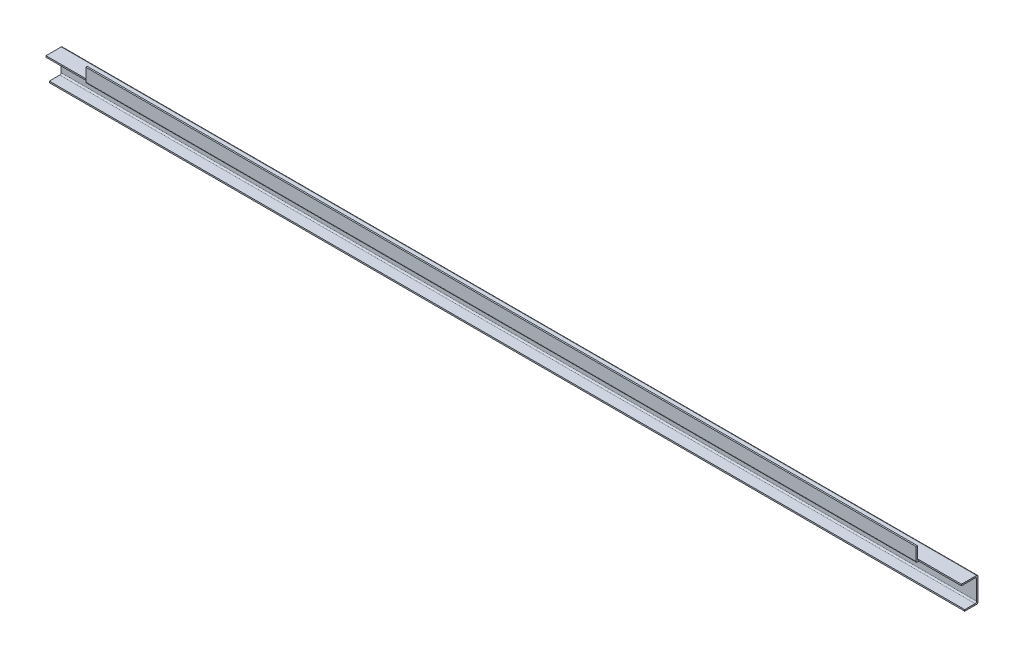
ISO-10303-21;
HEADER;
FILE_DESCRIPTION(('STEP AP214'),'2;1');
FILE_NAME('part.step','',(''),(''),'','','');
FILE_SCHEMA(('AUTOMOTIVE_DESIGN { 1 0 10303 214 1 1 1 1 }'));
ENDSEC;
DATA;
#1=APPLICATION_CONTEXT('core data for automotive mechanical design processes');
#2=APPLICATION_PROTOCOL_DEFINITION('international standard','automotive_design',2000,#1);
#3=PRODUCT_CONTEXT('',#1,'mechanical');
#4=PRODUCT('Part','Part','',(#3));
#5=PRODUCT_RELATED_PRODUCT_CATEGORY('part','',(#4));
#6=PRODUCT_DEFINITION_FORMATION('','',#4);
#7=PRODUCT_DEFINITION_CONTEXT('part definition',#1,'design');
#8=PRODUCT_DEFINITION('design','',#6,#7);
#9=PRODUCT_DEFINITION_SHAPE('','',#8);
#10=(LENGTH_UNIT() NAMED_UNIT(*) SI_UNIT(.MILLI.,.METRE.));
#11=(NAMED_UNIT(*) PLANE_ANGLE_UNIT() SI_UNIT($,.RADIAN.));
#12=(NAMED_UNIT(*) SI_UNIT($,.STERADIAN.) SOLID_ANGLE_UNIT());
#13=UNCERTAINTY_MEASURE_WITH_UNIT(LENGTH_MEASURE(1.E-05),#10,'distance_accuracy_value','');
#14=(GEOMETRIC_REPRESENTATION_CONTEXT(3) GLOBAL_UNCERTAINTY_ASSIGNED_CONTEXT((#13)) GLOBAL_UNIT_ASSIGNED_CONTEXT((#10,
#11,#12)) REPRESENTATION_CONTEXT('',''));
#15=CARTESIAN_POINT('',(0.,0.,0.));
#16=DIRECTION('',(0.,0.,1.));
#17=DIRECTION('',(1.,0.,0.));
#18=AXIS2_PLACEMENT_3D('',#15,#16,#17);
#19=CARTESIAN_POINT('',(1934.,0.,0.));
#20=DIRECTION('',(1.,0.,0.));
#21=DIRECTION('',(0.,0.,-1.));
#22=AXIS2_PLACEMENT_3D('',#19,#20,#21);
#23=PLANE('',#22);
#24=DIRECTION('',(0.,0.,1.));
#25=VECTOR('',#24,1.);
#26=CARTESIAN_POINT('',(1934.,50.,-28.));
#27=LINE('',#26,#25);
#28=CARTESIAN_POINT('',(1934.,50.,-25.));
#29=VERTEX_POINT('',#28);
#30=CARTESIAN_POINT('',(1934.,50.,7.00000000000001));
#31=VERTEX_POINT('',#30);
#32=EDGE_CURVE('E226',#29,#31,#27,.T.);
#33=ORIENTED_EDGE('',*,*,#32,.T.);
#34=DIRECTION('',(0.,1.,0.));
#35=VECTOR('',#34,1.);
#36=CARTESIAN_POINT('',(1934.,47.,7.00000000000001));
#37=LINE('',#36,#35);
#38=CARTESIAN_POINT('',(1934.,47.,7.00000000000001));
#39=VERTEX_POINT('',#38);
#40=EDGE_CURVE('E173',#39,#31,#37,.T.);
#41=ORIENTED_EDGE('',*,*,#40,.F.);
#42=DIRECTION('',(0.,0.,-1.));
#43=VECTOR('',#42,1.);
#44=CARTESIAN_POINT('',(1934.,47.,-25.));
#45=LINE('',#44,#43);
#46=CARTESIAN_POINT('',(1934.,47.,-22.));
#47=VERTEX_POINT('',#46);
#48=EDGE_CURVE('E183',#39,#47,#45,.T.);
#49=ORIENTED_EDGE('',*,*,#48,.T.);
#50=CARTESIAN_POINT('',(1934.,44.,-22.));
#51=DIRECTION('',(1.,0.,0.));
#52=DIRECTION('',(0.,0.,-1.));
#53=AXIS2_PLACEMENT_3D('',#50,#51,#52);
#54=CIRCLE('',#53,3.);
#55=CARTESIAN_POINT('',(1934.,44.,-25.));
#56=VERTEX_POINT('',#55);
#57=EDGE_CURVE('E307',#47,#56,#54,.F.);
#58=ORIENTED_EDGE('',*,*,#57,.T.);
#59=DIRECTION('',(0.,-1.,0.));
#60=VECTOR('',#59,1.);
#61=CARTESIAN_POINT('',(1934.,0.,-25.));
#62=LINE('',#61,#60);
#63=CARTESIAN_POINT('',(1934.,3.,-25.));
#64=VERTEX_POINT('',#63);
#65=EDGE_CURVE('E230',#56,#64,#62,.T.);
#66=ORIENTED_EDGE('',*,*,#65,.T.);
#67=CARTESIAN_POINT('',(1934.,3.,-22.));
#68=DIRECTION('',(1.,0.,0.));
#69=DIRECTION('',(0.,0.,-1.));
#70=AXIS2_PLACEMENT_3D('',#67,#68,#69);
#71=CIRCLE('',#70,3.);
#72=CARTESIAN_POINT('',(1934.,0.,-22.));
#73=VERTEX_POINT('',#72);
#74=EDGE_CURVE('E302',#64,#73,#71,.F.);
#75=ORIENTED_EDGE('',*,*,#74,.T.);
#76=DIRECTION('',(0.,0.,1.));
#77=VECTOR('',#76,1.);
#78=CARTESIAN_POINT('',(1934.,0.,0.));
#79=LINE('',#78,#77);
#80=CARTESIAN_POINT('',(1934.,0.,0.));
#81=VERTEX_POINT('',#80);
#82=EDGE_CURVE('E233',#73,#81,#79,.T.);
#83=ORIENTED_EDGE('',*,*,#82,.T.);
#84=DIRECTION('',(0.,-1.,0.));
#85=VECTOR('',#84,1.);
#86=CARTESIAN_POINT('',(1934.,0.,0.));
#87=LINE('',#86,#85);
#88=CARTESIAN_POINT('',(1934.,-3.,0.));
#89=VERTEX_POINT('',#88);
#90=EDGE_CURVE('E216',#81,#89,#87,.T.);
#91=ORIENTED_EDGE('',*,*,#90,.T.);
#92=DIRECTION('',(0.,0.,-1.));
#93=VECTOR('',#92,1.);
#94=CARTESIAN_POINT('',(1934.,-3.,0.));
#95=LINE('',#94,#93);
#96=CARTESIAN_POINT('',(1934.,-3.,-25.));
#97=VERTEX_POINT('',#96);
#98=EDGE_CURVE('E219',#89,#97,#95,.T.);
#99=ORIENTED_EDGE('',*,*,#98,.T.);
#100=CARTESIAN_POINT('',(1934.,0.,-25.));
#101=DIRECTION('',(1.,0.,0.));
#102=DIRECTION('',(0.,0.,-1.));
#103=AXIS2_PLACEMENT_3D('',#100,#101,#102);
#104=CIRCLE('',#103,3.);
#105=CARTESIAN_POINT('',(1934.,0.,-28.));
#106=VERTEX_POINT('',#105);
#107=EDGE_CURVE('E275',#97,#106,#104,.T.);
#108=ORIENTED_EDGE('',*,*,#107,.T.);
#109=DIRECTION('',(0.,1.,0.));
#110=VECTOR('',#109,1.);
#111=CARTESIAN_POINT('',(1934.,-3.,-28.));
#112=LINE('',#111,#110);
#113=CARTESIAN_POINT('',(1934.,47.,-28.));
#114=VERTEX_POINT('',#113);
#115=EDGE_CURVE('E223',#106,#114,#112,.T.);
#116=ORIENTED_EDGE('',*,*,#115,.T.);
#117=CARTESIAN_POINT('',(1934.,47.,-25.));
#118=DIRECTION('',(1.,0.,0.));
#119=DIRECTION('',(0.,0.,-1.));
#120=AXIS2_PLACEMENT_3D('',#117,#118,#119);
#121=CIRCLE('',#120,3.);
#122=EDGE_CURVE('E273',#114,#29,#121,.T.);
#123=ORIENTED_EDGE('',*,*,#122,.T.);
#124=EDGE_LOOP('',(#33,#41,#49,#58,#66,#75,#83,#91,#99,#108,#116,#123));
#125=FACE_BOUND('',#124,.T.);
#126=ADVANCED_FACE('F33',(#125),#23,.T.);
#127=CARTESIAN_POINT('',(1934.,0.,0.));
#128=DIRECTION('',(0.,0.,-1.));
#129=DIRECTION('',(-1.,0.,0.));
#130=AXIS2_PLACEMENT_3D('',#127,#128,#129);
#131=PLANE('',#130);
#132=DIRECTION('',(0.,-1.,0.));
#133=VECTOR('',#132,1.);
#134=CARTESIAN_POINT('',(0.,0.,0.));
#135=LINE('',#134,#133);
#136=CARTESIAN_POINT('',(0.,0.,0.));
#137=VERTEX_POINT('',#136);
#138=CARTESIAN_POINT('',(0.,-3.,0.));
#139=VERTEX_POINT('',#138);
#140=EDGE_CURVE('E215',#137,#139,#135,.T.);
#141=ORIENTED_EDGE('',*,*,#140,.T.);
#142=DIRECTION('',(-1.,0.,0.));
#143=VECTOR('',#142,1.);
#144=CARTESIAN_POINT('',(1934.,-3.,0.));
#145=LINE('',#144,#143);
#146=EDGE_CURVE('E259',#89,#139,#145,.T.);
#147=ORIENTED_EDGE('',*,*,#146,.F.);
#148=ORIENTED_EDGE('',*,*,#90,.F.);
#149=DIRECTION('',(-1.,0.,0.));
#150=VECTOR('',#149,1.);
#151=CARTESIAN_POINT('',(1934.,0.,0.));
#152=LINE('',#151,#150);
#153=EDGE_CURVE('E235',#81,#137,#152,.T.);
#154=ORIENTED_EDGE('',*,*,#153,.T.);
#155=EDGE_LOOP('',(#141,#147,#148,#154));
#156=FACE_BOUND('',#155,.T.);
#157=ADVANCED_FACE('F330',(#156),#131,.F.);
#158=CARTESIAN_POINT('',(1934.,-3.,0.));
#159=DIRECTION('',(0.,1.,0.));
#160=DIRECTION('',(0.,0.,1.));
#161=AXIS2_PLACEMENT_3D('',#158,#159,#160);
#162=PLANE('',#161);
#163=DIRECTION('',(0.,0.,-1.));
#164=VECTOR('',#163,1.);
#165=CARTESIAN_POINT('',(0.,-3.,0.));
#166=LINE('',#165,#164);
#167=CARTESIAN_POINT('',(0.,-3.,-25.));
#168=VERTEX_POINT('',#167);
#169=EDGE_CURVE('E238',#139,#168,#166,.T.);
#170=ORIENTED_EDGE('',*,*,#169,.T.);
#171=DIRECTION('',(-1.,0.,0.));
#172=VECTOR('',#171,1.);
#173=CARTESIAN_POINT('',(1934.,-3.,-25.));
#174=LINE('',#173,#172);
#175=EDGE_CURVE('E271',#168,#97,#174,.F.);
#176=ORIENTED_EDGE('',*,*,#175,.T.);
#177=ORIENTED_EDGE('',*,*,#98,.F.);
#178=ORIENTED_EDGE('',*,*,#146,.T.);
#179=EDGE_LOOP('',(#170,#176,#177,#178));
#180=FACE_BOUND('',#179,.T.);
#181=ADVANCED_FACE('F336',(#180),#162,.F.);
#182=CARTESIAN_POINT('',(1934.,-3.,-28.));
#183=DIRECTION('',(0.,0.,1.));
#184=DIRECTION('',(1.,0.,0.));
#185=AXIS2_PLACEMENT_3D('',#182,#183,#184);
#186=PLANE('',#185);
#187=ORIENTED_EDGE('',*,*,#115,.F.);
#188=DIRECTION('',(-1.,0.,0.));
#189=VECTOR('',#188,1.);
#190=CARTESIAN_POINT('',(1934.,0.,-28.));
#191=LINE('',#190,#189);
#192=CARTESIAN_POINT('',(0.,0.,-28.));
#193=VERTEX_POINT('',#192);
#194=EDGE_CURVE('E264',#106,#193,#191,.T.);
#195=ORIENTED_EDGE('',*,*,#194,.T.);
#196=DIRECTION('',(0.,1.,0.));
#197=VECTOR('',#196,1.);
#198=CARTESIAN_POINT('',(0.,-3.,-28.));
#199=LINE('',#198,#197);
#200=CARTESIAN_POINT('',(0.,47.,-28.));
#201=VERTEX_POINT('',#200);
#202=EDGE_CURVE('E241',#193,#201,#199,.T.);
#203=ORIENTED_EDGE('',*,*,#202,.T.);
#204=DIRECTION('',(-1.,0.,0.));
#205=VECTOR('',#204,1.);
#206=CARTESIAN_POINT('',(1934.,47.,-28.));
#207=LINE('',#206,#205);
#208=EDGE_CURVE('E262',#201,#114,#207,.F.);
#209=ORIENTED_EDGE('',*,*,#208,.T.);
#210=EDGE_LOOP('',(#187,#195,#203,#209));
#211=FACE_BOUND('',#210,.T.);
#212=ADVANCED_FACE('F369',(#211),#186,.F.);
#213=CARTESIAN_POINT('',(1934.,50.,-28.));
#214=DIRECTION('',(0.,-1.,0.));
#215=DIRECTION('',(0.,0.,-1.));
#216=AXIS2_PLACEMENT_3D('',#213,#214,#215);
#217=PLANE('',#216);
#218=ORIENTED_EDGE('',*,*,#32,.F.);
#219=DIRECTION('',(-1.,0.,0.));
#220=VECTOR('',#219,1.);
#221=CARTESIAN_POINT('',(1934.,50.,-25.));
#222=LINE('',#221,#220);
#223=CARTESIAN_POINT('',(0.,50.,-25.));
#224=VERTEX_POINT('',#223);
#225=EDGE_CURVE('E280',#29,#224,#222,.T.);
#226=ORIENTED_EDGE('',*,*,#225,.T.);
#227=DIRECTION('',(0.,0.,1.));
#228=VECTOR('',#227,1.);
#229=CARTESIAN_POINT('',(0.,50.,-28.));
#230=LINE('',#229,#228);
#231=CARTESIAN_POINT('',(0.,50.,7.00000000000001));
#232=VERTEX_POINT('',#231);
#233=EDGE_CURVE('E244',#224,#232,#230,.T.);
#234=ORIENTED_EDGE('',*,*,#233,.T.);
#235=DIRECTION('',(-1.,0.,0.));
#236=VECTOR('',#235,1.);
#237=CARTESIAN_POINT('',(1934.,50.,7.));
#238=LINE('',#237,#236);
#239=CARTESIAN_POINT('',(89.9999999999999,50.,7.00000000000001));
#240=VERTEX_POINT('',#239);
#241=EDGE_CURVE('E277',#232,#240,#238,.F.);
#242=ORIENTED_EDGE('',*,*,#241,.T.);
#243=CARTESIAN_POINT('',(1844.,50.,7.00000000000001));
#244=VERTEX_POINT('',#243);
#245=EDGE_CURVE('E281',#240,#244,#238,.F.);
#246=ORIENTED_EDGE('',*,*,#245,.T.);
#247=EDGE_CURVE('E171',#244,#31,#238,.F.);
#248=ORIENTED_EDGE('',*,*,#247,.T.);
#249=EDGE_LOOP('',(#218,#226,#234,#242,#246,#248));
#250=FACE_BOUND('',#249,.T.);
#251=ADVANCED_FACE('F365',(#250),#217,.F.);
#252=CARTESIAN_POINT('',(1934.,50.,10.));
#253=DIRECTION('',(0.,0.,1.));
#254=DIRECTION('',(1.,0.,0.));
#255=AXIS2_PLACEMENT_3D('',#252,#253,#254);
#256=PLANE('',#255);
#257=DIRECTION('',(-1.,0.,0.));
#258=VECTOR('',#257,1.);
#259=CARTESIAN_POINT('',(1934.,77.,10.));
#260=LINE('',#259,#258);
#261=CARTESIAN_POINT('',(1844.,77.,10.));
#262=VERTEX_POINT('',#261);
#263=CARTESIAN_POINT('',(89.9999999999999,76.9999999999999,10.));
#264=VERTEX_POINT('',#263);
#265=EDGE_CURVE('E257',#262,#264,#260,.T.);
#266=ORIENTED_EDGE('',*,*,#265,.F.);
#267=DIRECTION('',(0.,-1.,0.));
#268=VECTOR('',#267,1.);
#269=CARTESIAN_POINT('',(1844.,50.,10.));
#270=LINE('',#269,#268);
#271=CARTESIAN_POINT('',(1844.,53.,10.));
#272=VERTEX_POINT('',#271);
#273=EDGE_CURVE('E190',#262,#272,#270,.T.);
#274=ORIENTED_EDGE('',*,*,#273,.T.);
#275=DIRECTION('',(-1.,0.,0.));
#276=VECTOR('',#275,1.);
#277=CARTESIAN_POINT('',(0.,53.,10.));
#278=LINE('',#277,#276);
#279=CARTESIAN_POINT('',(89.9999999999999,53.,10.));
#280=VERTEX_POINT('',#279);
#281=EDGE_CURVE('E284',#272,#280,#278,.T.);
#282=ORIENTED_EDGE('',*,*,#281,.T.);
#283=DIRECTION('',(0.,1.,0.));
#284=VECTOR('',#283,1.);
#285=CARTESIAN_POINT('',(89.9999999999999,50.,10.));
#286=LINE('',#285,#284);
#287=EDGE_CURVE('E212',#280,#264,#286,.T.);
#288=ORIENTED_EDGE('',*,*,#287,.T.);
#289=EDGE_LOOP('',(#266,#274,#282,#288));
#290=FACE_BOUND('',#289,.T.);
#291=ADVANCED_FACE('F361',(#290),#256,.F.);
#292=CARTESIAN_POINT('',(1934.,77.,13.));
#293=DIRECTION('',(0.,-1.,0.));
#294=DIRECTION('',(0.,0.,-1.));
#295=AXIS2_PLACEMENT_3D('',#292,#293,#294);
#296=PLANE('',#295);
#297=DIRECTION('',(-1.,0.,0.));
#298=VECTOR('',#297,1.);
#299=CARTESIAN_POINT('',(1934.,77.,13.));
#300=LINE('',#299,#298);
#301=CARTESIAN_POINT('',(1844.,77.,13.));
#302=VERTEX_POINT('',#301);
#303=CARTESIAN_POINT('',(89.9999999999999,76.9999999999999,13.));
#304=VERTEX_POINT('',#303);
#305=EDGE_CURVE('E255',#302,#304,#300,.T.);
#306=ORIENTED_EDGE('',*,*,#305,.F.);
#307=DIRECTION('',(0.,0.,1.));
#308=VECTOR('',#307,1.);
#309=CARTESIAN_POINT('',(1844.,77.,7.00000000000001));
#310=LINE('',#309,#308);
#311=EDGE_CURVE('E178',#262,#302,#310,.T.);
#312=ORIENTED_EDGE('',*,*,#311,.F.);
#313=ORIENTED_EDGE('',*,*,#265,.T.);
#314=DIRECTION('',(0.,0.,1.));
#315=VECTOR('',#314,1.);
#316=CARTESIAN_POINT('',(89.9999999999999,76.9999999999999,7.00000000000001));
#317=LINE('',#316,#315);
#318=EDGE_CURVE('E205',#264,#304,#317,.T.);
#319=ORIENTED_EDGE('',*,*,#318,.T.);
#320=EDGE_LOOP('',(#306,#312,#313,#319));
#321=FACE_BOUND('',#320,.T.);
#322=ADVANCED_FACE('F358',(#321),#296,.F.);
#323=CARTESIAN_POINT('',(1934.,47.,13.));
#324=DIRECTION('',(0.,0.,-1.));
#325=DIRECTION('',(0.,1.,0.));
#326=AXIS2_PLACEMENT_3D('',#323,#324,#325);
#327=PLANE('',#326);
#328=DIRECTION('',(-1.,0.,0.));
#329=VECTOR('',#328,1.);
#330=CARTESIAN_POINT('',(1934.,50.,13.));
#331=LINE('',#330,#329);
#332=CARTESIAN_POINT('',(89.9999999999999,50.,13.));
#333=VERTEX_POINT('',#332);
#334=CARTESIAN_POINT('',(1844.,50.,13.));
#335=VERTEX_POINT('',#334);
#336=EDGE_CURVE('E297',#333,#335,#331,.F.);
#337=ORIENTED_EDGE('',*,*,#336,.T.);
#338=DIRECTION('',(0.,-1.,0.));
#339=VECTOR('',#338,1.);
#340=CARTESIAN_POINT('',(1844.,77.,13.));
#341=LINE('',#340,#339);
#342=EDGE_CURVE('E47',#302,#335,#341,.T.);
#343=ORIENTED_EDGE('',*,*,#342,.F.);
#344=ORIENTED_EDGE('',*,*,#305,.T.);
#345=DIRECTION('',(0.,1.,0.));
#346=VECTOR('',#345,1.);
#347=CARTESIAN_POINT('',(89.9999999999999,76.9999999999999,13.));
#348=LINE('',#347,#346);
#349=EDGE_CURVE('E193',#333,#304,#348,.T.);
#350=ORIENTED_EDGE('',*,*,#349,.F.);
#351=EDGE_LOOP('',(#337,#343,#344,#350));
#352=FACE_BOUND('',#351,.T.);
#353=ADVANCED_FACE('F316',(#352),#327,.F.);
#354=CARTESIAN_POINT('',(1934.,47.,-25.));
#355=DIRECTION('',(0.,1.,0.));
#356=DIRECTION('',(0.,0.,1.));
#357=AXIS2_PLACEMENT_3D('',#354,#355,#356);
#358=PLANE('',#357);
#359=DIRECTION('',(1.,0.,0.));
#360=VECTOR('',#359,1.);
#361=CARTESIAN_POINT('',(1844.,47.,7.00000000000001));
#362=LINE('',#361,#360);
#363=CARTESIAN_POINT('',(1844.,47.,7.00000000000001));
#364=VERTEX_POINT('',#363);
#365=EDGE_CURVE('E168',#364,#39,#362,.T.);
#366=ORIENTED_EDGE('',*,*,#365,.F.);
#367=DIRECTION('',(0.,0.,1.));
#368=VECTOR('',#367,1.);
#369=CARTESIAN_POINT('',(1844.,47.,7.00000000000001));
#370=LINE('',#369,#368);
#371=CARTESIAN_POINT('',(1844.,47.,10.));
#372=VERTEX_POINT('',#371);
#373=EDGE_CURVE('E175',#364,#372,#370,.T.);
#374=ORIENTED_EDGE('',*,*,#373,.T.);
#375=DIRECTION('',(-1.,0.,0.));
#376=VECTOR('',#375,1.);
#377=CARTESIAN_POINT('',(1934.,47.,10.));
#378=LINE('',#377,#376);
#379=CARTESIAN_POINT('',(89.9999999999999,47.,10.));
#380=VERTEX_POINT('',#379);
#381=EDGE_CURVE('E55',#372,#380,#378,.T.);
#382=ORIENTED_EDGE('',*,*,#381,.T.);
#383=DIRECTION('',(0.,0.,1.));
#384=VECTOR('',#383,1.);
#385=CARTESIAN_POINT('',(89.9999999999999,47.,7.00000000000001));
#386=LINE('',#385,#384);
#387=CARTESIAN_POINT('',(89.9999999999999,47.,7.00000000000001));
#388=VERTEX_POINT('',#387);
#389=EDGE_CURVE('E202',#388,#380,#386,.T.);
#390=ORIENTED_EDGE('',*,*,#389,.F.);
#391=DIRECTION('',(1.,0.,0.));
#392=VECTOR('',#391,1.);
#393=CARTESIAN_POINT('',(89.9999999999999,47.,7.00000000000001));
#394=LINE('',#393,#392);
#395=CARTESIAN_POINT('',(0.,47.,7.00000000000001));
#396=VERTEX_POINT('',#395);
#397=EDGE_CURVE('E196',#396,#388,#394,.T.);
#398=ORIENTED_EDGE('',*,*,#397,.F.);
#399=DIRECTION('',(0.,0.,-1.));
#400=VECTOR('',#399,1.);
#401=CARTESIAN_POINT('',(0.,47.,-25.));
#402=LINE('',#401,#400);
#403=CARTESIAN_POINT('',(0.,47.,-22.));
#404=VERTEX_POINT('',#403);
#405=EDGE_CURVE('E247',#396,#404,#402,.T.);
#406=ORIENTED_EDGE('',*,*,#405,.T.);
#407=DIRECTION('',(-1.,0.,0.));
#408=VECTOR('',#407,1.);
#409=CARTESIAN_POINT('',(1934.,47.,-22.));
#410=LINE('',#409,#408);
#411=EDGE_CURVE('E295',#404,#47,#410,.F.);
#412=ORIENTED_EDGE('',*,*,#411,.T.);
#413=ORIENTED_EDGE('',*,*,#48,.F.);
#414=EDGE_LOOP('',(#366,#374,#382,#390,#398,#406,#412,#413));
#415=FACE_BOUND('',#414,.T.);
#416=ADVANCED_FACE('F181',(#415),#358,.F.);
#417=CARTESIAN_POINT('',(1934.,0.,-25.));
#418=DIRECTION('',(0.,0.,-1.));
#419=DIRECTION('',(-1.,0.,0.));
#420=AXIS2_PLACEMENT_3D('',#417,#418,#419);
#421=PLANE('',#420);
#422=DIRECTION('',(0.,-1.,0.));
#423=VECTOR('',#422,1.);
#424=CARTESIAN_POINT('',(0.,0.,-25.));
#425=LINE('',#424,#423);
#426=CARTESIAN_POINT('',(0.,44.,-25.));
#427=VERTEX_POINT('',#426);
#428=CARTESIAN_POINT('',(0.,3.,-25.));
#429=VERTEX_POINT('',#428);
#430=EDGE_CURVE('E249',#427,#429,#425,.T.);
#431=ORIENTED_EDGE('',*,*,#430,.T.);
#432=DIRECTION('',(-1.,0.,0.));
#433=VECTOR('',#432,1.);
#434=CARTESIAN_POINT('',(1934.,3.,-25.));
#435=LINE('',#434,#433);
#436=EDGE_CURVE('E292',#429,#64,#435,.F.);
#437=ORIENTED_EDGE('',*,*,#436,.T.);
#438=ORIENTED_EDGE('',*,*,#65,.F.);
#439=DIRECTION('',(-1.,0.,0.));
#440=VECTOR('',#439,1.);
#441=CARTESIAN_POINT('',(0.,44.,-25.));
#442=LINE('',#441,#440);
#443=EDGE_CURVE('E289',#56,#427,#442,.T.);
#444=ORIENTED_EDGE('',*,*,#443,.T.);
#445=EDGE_LOOP('',(#431,#437,#438,#444));
#446=FACE_BOUND('',#445,.T.);
#447=ADVANCED_FACE('F349',(#446),#421,.F.);
#448=CARTESIAN_POINT('',(1934.,0.,0.));
#449=DIRECTION('',(0.,-1.,0.));
#450=DIRECTION('',(0.,0.,-1.));
#451=AXIS2_PLACEMENT_3D('',#448,#449,#450);
#452=PLANE('',#451);
#453=ORIENTED_EDGE('',*,*,#82,.F.);
#454=DIRECTION('',(-1.,0.,0.));
#455=VECTOR('',#454,1.);
#456=CARTESIAN_POINT('',(0.,0.,-22.));
#457=LINE('',#456,#455);
#458=CARTESIAN_POINT('',(0.,0.,-22.));
#459=VERTEX_POINT('',#458);
#460=EDGE_CURVE('E286',#73,#459,#457,.T.);
#461=ORIENTED_EDGE('',*,*,#460,.T.);
#462=DIRECTION('',(0.,0.,1.));
#463=VECTOR('',#462,1.);
#464=CARTESIAN_POINT('',(0.,0.,0.));
#465=LINE('',#464,#463);
#466=EDGE_CURVE('E220',#459,#137,#465,.T.);
#467=ORIENTED_EDGE('',*,*,#466,.T.);
#468=ORIENTED_EDGE('',*,*,#153,.F.);
#469=EDGE_LOOP('',(#453,#461,#467,#468));
#470=FACE_BOUND('',#469,.T.);
#471=ADVANCED_FACE('F345',(#470),#452,.F.);
#472=CARTESIAN_POINT('',(0.,0.,0.));
#473=DIRECTION('',(1.,0.,0.));
#474=DIRECTION('',(0.,0.,-1.));
#475=AXIS2_PLACEMENT_3D('',#472,#473,#474);
#476=PLANE('',#475);
#477=ORIENTED_EDGE('',*,*,#405,.F.);
#478=DIRECTION('',(0.,-1.,0.));
#479=VECTOR('',#478,1.);
#480=CARTESIAN_POINT('',(0.,47.,7.00000000000001));
#481=LINE('',#480,#479);
#482=EDGE_CURVE('E194',#232,#396,#481,.T.);
#483=ORIENTED_EDGE('',*,*,#482,.F.);
#484=ORIENTED_EDGE('',*,*,#233,.F.);
#485=CARTESIAN_POINT('',(0.,47.,-25.));
#486=DIRECTION('',(1.,0.,0.));
#487=DIRECTION('',(0.,0.,-1.));
#488=AXIS2_PLACEMENT_3D('',#485,#486,#487);
#489=CIRCLE('',#488,3.);
#490=EDGE_CURVE('E267',#224,#201,#489,.F.);
#491=ORIENTED_EDGE('',*,*,#490,.T.);
#492=ORIENTED_EDGE('',*,*,#202,.F.);
#493=CARTESIAN_POINT('',(0.,0.,-25.));
#494=DIRECTION('',(1.,0.,0.));
#495=DIRECTION('',(0.,0.,-1.));
#496=AXIS2_PLACEMENT_3D('',#493,#494,#495);
#497=CIRCLE('',#496,3.);
#498=EDGE_CURVE('E269',#193,#168,#497,.F.);
#499=ORIENTED_EDGE('',*,*,#498,.T.);
#500=ORIENTED_EDGE('',*,*,#169,.F.);
#501=ORIENTED_EDGE('',*,*,#140,.F.);
#502=ORIENTED_EDGE('',*,*,#466,.F.);
#503=CARTESIAN_POINT('',(0.,3.,-22.));
#504=DIRECTION('',(1.,0.,0.));
#505=DIRECTION('',(0.,0.,-1.));
#506=AXIS2_PLACEMENT_3D('',#503,#504,#505);
#507=CIRCLE('',#506,3.);
#508=EDGE_CURVE('E300',#459,#429,#507,.T.);
#509=ORIENTED_EDGE('',*,*,#508,.T.);
#510=ORIENTED_EDGE('',*,*,#430,.F.);
#511=CARTESIAN_POINT('',(0.,44.,-22.));
#512=DIRECTION('',(1.,0.,0.));
#513=DIRECTION('',(0.,0.,-1.));
#514=AXIS2_PLACEMENT_3D('',#511,#512,#513);
#515=CIRCLE('',#514,3.);
#516=EDGE_CURVE('E304',#427,#404,#515,.T.);
#517=ORIENTED_EDGE('',*,*,#516,.T.);
#518=EDGE_LOOP('',(#477,#483,#484,#491,#492,#499,#500,#501,#502,#509,#510,#517));
#519=FACE_BOUND('',#518,.T.);
#520=ADVANCED_FACE('F341',(#519),#476,.F.);
#521=CARTESIAN_POINT('',(1934.,0.,-25.));
#522=DIRECTION('',(-1.,0.,0.));
#523=DIRECTION('',(0.,0.,1.));
#524=AXIS2_PLACEMENT_3D('',#521,#522,#523);
#525=CYLINDRICAL_SURFACE('',#524,3.);
#526=ORIENTED_EDGE('',*,*,#107,.F.);
#527=ORIENTED_EDGE('',*,*,#175,.F.);
#528=ORIENTED_EDGE('',*,*,#498,.F.);
#529=ORIENTED_EDGE('',*,*,#194,.F.);
#530=EDGE_LOOP('',(#526,#527,#528,#529));
#531=FACE_BOUND('',#530,.T.);
#532=ADVANCED_FACE('F344',(#531),#525,.T.);
#533=CARTESIAN_POINT('',(1934.,47.,-25.));
#534=DIRECTION('',(-1.,0.,0.));
#535=DIRECTION('',(0.,0.,1.));
#536=AXIS2_PLACEMENT_3D('',#533,#534,#535);
#537=CYLINDRICAL_SURFACE('',#536,3.);
#538=ORIENTED_EDGE('',*,*,#122,.F.);
#539=ORIENTED_EDGE('',*,*,#208,.F.);
#540=ORIENTED_EDGE('',*,*,#490,.F.);
#541=ORIENTED_EDGE('',*,*,#225,.F.);
#542=EDGE_LOOP('',(#538,#539,#540,#541));
#543=FACE_BOUND('',#542,.T.);
#544=ADVANCED_FACE('F379',(#543),#537,.T.);
#545=CARTESIAN_POINT('',(1934.,53.,7.));
#546=DIRECTION('',(1.,0.,0.));
#547=DIRECTION('',(0.,0.,-1.));
#548=AXIS2_PLACEMENT_3D('',#545,#546,#547);
#549=CYLINDRICAL_SURFACE('',#548,3.);
#550=ORIENTED_EDGE('',*,*,#281,.F.);
#551=CARTESIAN_POINT('',(1844.,53.,7.));
#552=DIRECTION('',(-1.,0.,0.));
#553=DIRECTION('',(0.,0.,1.));
#554=AXIS2_PLACEMENT_3D('',#551,#552,#553);
#555=CIRCLE('',#554,3.);
#556=EDGE_CURVE('E177',#272,#244,#555,.F.);
#557=ORIENTED_EDGE('',*,*,#556,.T.);
#558=ORIENTED_EDGE('',*,*,#245,.F.);
#559=CARTESIAN_POINT('',(89.9999999999999,53.,7.));
#560=DIRECTION('',(1.,0.,0.));
#561=DIRECTION('',(0.,0.,-1.));
#562=AXIS2_PLACEMENT_3D('',#559,#560,#561);
#563=CIRCLE('',#562,3.);
#564=EDGE_CURVE('E208',#240,#280,#563,.F.);
#565=ORIENTED_EDGE('',*,*,#564,.T.);
#566=EDGE_LOOP('',(#550,#557,#558,#565));
#567=FACE_BOUND('',#566,.T.);
#568=ADVANCED_FACE('F383',(#567),#549,.F.);
#569=CARTESIAN_POINT('',(1934.,3.,-22.));
#570=DIRECTION('',(1.,0.,0.));
#571=DIRECTION('',(0.,0.,-1.));
#572=AXIS2_PLACEMENT_3D('',#569,#570,#571);
#573=CYLINDRICAL_SURFACE('',#572,3.);
#574=ORIENTED_EDGE('',*,*,#74,.F.);
#575=ORIENTED_EDGE('',*,*,#436,.F.);
#576=ORIENTED_EDGE('',*,*,#508,.F.);
#577=ORIENTED_EDGE('',*,*,#460,.F.);
#578=EDGE_LOOP('',(#574,#575,#576,#577));
#579=FACE_BOUND('',#578,.T.);
#580=ADVANCED_FACE('F327',(#579),#573,.F.);
#581=CARTESIAN_POINT('',(1934.,44.,-22.));
#582=DIRECTION('',(1.,0.,0.));
#583=DIRECTION('',(0.,0.,-1.));
#584=AXIS2_PLACEMENT_3D('',#581,#582,#583);
#585=CYLINDRICAL_SURFACE('',#584,3.);
#586=ORIENTED_EDGE('',*,*,#57,.F.);
#587=ORIENTED_EDGE('',*,*,#411,.F.);
#588=ORIENTED_EDGE('',*,*,#516,.F.);
#589=ORIENTED_EDGE('',*,*,#443,.F.);
#590=EDGE_LOOP('',(#586,#587,#588,#589));
#591=FACE_BOUND('',#590,.T.);
#592=ADVANCED_FACE('F320',(#591),#585,.F.);
#593=CARTESIAN_POINT('',(1934.,50.,10.));
#594=DIRECTION('',(-1.,0.,0.));
#595=DIRECTION('',(0.,0.,1.));
#596=AXIS2_PLACEMENT_3D('',#593,#594,#595);
#597=CYLINDRICAL_SURFACE('',#596,3.);
#598=CARTESIAN_POINT('',(1844.,50.,10.));
#599=DIRECTION('',(-1.,0.,0.));
#600=DIRECTION('',(0.,0.,1.));
#601=AXIS2_PLACEMENT_3D('',#598,#599,#600);
#602=CIRCLE('',#601,3.);
#603=EDGE_CURVE('E11',#335,#372,#602,.F.);
#604=ORIENTED_EDGE('',*,*,#603,.F.);
#605=ORIENTED_EDGE('',*,*,#336,.F.);
#606=CARTESIAN_POINT('',(89.9999999999999,50.,10.));
#607=DIRECTION('',(1.,0.,0.));
#608=DIRECTION('',(0.,0.,-1.));
#609=AXIS2_PLACEMENT_3D('',#606,#607,#608);
#610=CIRCLE('',#609,3.);
#611=EDGE_CURVE('E41',#380,#333,#610,.F.);
#612=ORIENTED_EDGE('',*,*,#611,.F.);
#613=ORIENTED_EDGE('',*,*,#381,.F.);
#614=EDGE_LOOP('',(#604,#605,#612,#613));
#615=FACE_BOUND('',#614,.T.);
#616=ADVANCED_FACE('F35',(#615),#597,.T.);
#617=CARTESIAN_POINT('',(0.,0.,7.00000000000001));
#618=DIRECTION('',(0.,0.,-1.));
#619=DIRECTION('',(-1.,0.,0.));
#620=AXIS2_PLACEMENT_3D('',#617,#618,#619);
#621=PLANE('',#620);
#622=ORIENTED_EDGE('',*,*,#482,.T.);
#623=ORIENTED_EDGE('',*,*,#397,.T.);
#624=DIRECTION('',(0.,1.,0.));
#625=VECTOR('',#624,1.);
#626=CARTESIAN_POINT('',(89.9999999999999,76.9999999999999,7.00000000000001));
#627=LINE('',#626,#625);
#628=EDGE_CURVE('E199',#388,#240,#627,.T.);
#629=ORIENTED_EDGE('',*,*,#628,.T.);
#630=ORIENTED_EDGE('',*,*,#241,.F.);
#631=EDGE_LOOP('',(#622,#623,#629,#630));
#632=FACE_BOUND('',#631,.T.);
#633=ADVANCED_FACE('F319',(#632),#621,.F.);
#634=CARTESIAN_POINT('',(89.9999999999999,76.9999999999999,7.00000000000001));
#635=DIRECTION('',(1.,0.,0.));
#636=DIRECTION('',(0.,0.,-1.));
#637=AXIS2_PLACEMENT_3D('',#634,#635,#636);
#638=PLANE('',#637);
#639=ORIENTED_EDGE('',*,*,#564,.F.);
#640=ORIENTED_EDGE('',*,*,#628,.F.);
#641=ORIENTED_EDGE('',*,*,#389,.T.);
#642=ORIENTED_EDGE('',*,*,#611,.T.);
#643=ORIENTED_EDGE('',*,*,#349,.T.);
#644=ORIENTED_EDGE('',*,*,#318,.F.);
#645=ORIENTED_EDGE('',*,*,#287,.F.);
#646=EDGE_LOOP('',(#639,#640,#641,#642,#643,#644,#645));
#647=FACE_BOUND('',#646,.T.);
#648=ADVANCED_FACE('F311',(#647),#638,.F.);
#649=CARTESIAN_POINT('',(0.,0.,7.00000000000001));
#650=DIRECTION('',(0.,0.,1.));
#651=DIRECTION('',(1.,0.,0.));
#652=AXIS2_PLACEMENT_3D('',#649,#650,#651);
#653=PLANE('',#652);
#654=ORIENTED_EDGE('',*,*,#247,.F.);
#655=DIRECTION('',(0.,-1.,0.));
#656=VECTOR('',#655,1.);
#657=CARTESIAN_POINT('',(1844.,77.,7.00000000000001));
#658=LINE('',#657,#656);
#659=EDGE_CURVE('E164',#244,#364,#658,.T.);
#660=ORIENTED_EDGE('',*,*,#659,.T.);
#661=ORIENTED_EDGE('',*,*,#365,.T.);
#662=ORIENTED_EDGE('',*,*,#40,.T.);
#663=EDGE_LOOP('',(#654,#660,#661,#662));
#664=FACE_BOUND('',#663,.T.);
#665=ADVANCED_FACE('F166',(#664),#653,.T.);
#666=CARTESIAN_POINT('',(1844.,77.,7.00000000000001));
#667=DIRECTION('',(-1.,0.,0.));
#668=DIRECTION('',(0.,0.,1.));
#669=AXIS2_PLACEMENT_3D('',#666,#667,#668);
#670=PLANE('',#669);
#671=ORIENTED_EDGE('',*,*,#311,.T.);
#672=ORIENTED_EDGE('',*,*,#342,.T.);
#673=ORIENTED_EDGE('',*,*,#603,.T.);
#674=ORIENTED_EDGE('',*,*,#373,.F.);
#675=ORIENTED_EDGE('',*,*,#659,.F.);
#676=ORIENTED_EDGE('',*,*,#556,.F.);
#677=ORIENTED_EDGE('',*,*,#273,.F.);
#678=EDGE_LOOP('',(#671,#672,#673,#674,#675,#676,#677));
#679=FACE_BOUND('',#678,.T.);
#680=ADVANCED_FACE('F176',(#679),#670,.F.);
#681=CLOSED_SHELL('',(#126,#157,#181,#212,#251,#291,#322,#353,#416,#447,#471,#520,#532,#544,
#568,#580,#592,#616,#633,#648,#665,#680));
#682=MANIFOLD_SOLID_BREP('B2',#681);
#683=ADVANCED_BREP_SHAPE_REPRESENTATION('',(#18,#682),#14);
#684=SHAPE_DEFINITION_REPRESENTATION(#9,#683);
ENDSEC;
END-ISO-10303-21;
